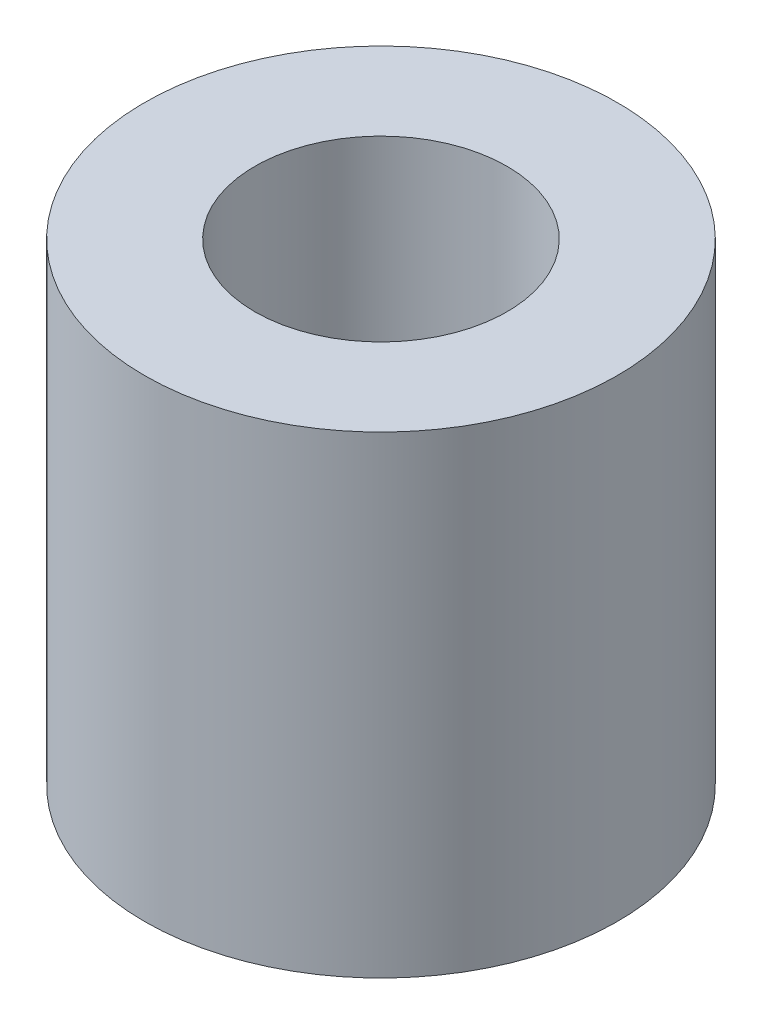
ISO-10303-21;
HEADER;
FILE_DESCRIPTION(('STEP AP214'),'2;1');
FILE_NAME('part.step','',(''),(''),'','','');
FILE_SCHEMA(('AUTOMOTIVE_DESIGN { 1 0 10303 214 1 1 1 1 }'));
ENDSEC;
DATA;
#1=APPLICATION_CONTEXT('core data for automotive mechanical design processes');
#2=APPLICATION_PROTOCOL_DEFINITION('international standard','automotive_design',2000,#1);
#3=PRODUCT_CONTEXT('',#1,'mechanical');
#4=PRODUCT('Part','Part','',(#3));
#5=PRODUCT_RELATED_PRODUCT_CATEGORY('part','',(#4));
#6=PRODUCT_DEFINITION_FORMATION('','',#4);
#7=PRODUCT_DEFINITION_CONTEXT('part definition',#1,'design');
#8=PRODUCT_DEFINITION('design','',#6,#7);
#9=PRODUCT_DEFINITION_SHAPE('','',#8);
#10=(LENGTH_UNIT() NAMED_UNIT(*) SI_UNIT(.MILLI.,.METRE.));
#11=(NAMED_UNIT(*) PLANE_ANGLE_UNIT() SI_UNIT($,.RADIAN.));
#12=(NAMED_UNIT(*) SI_UNIT($,.STERADIAN.) SOLID_ANGLE_UNIT());
#13=UNCERTAINTY_MEASURE_WITH_UNIT(LENGTH_MEASURE(1.E-05),#10,'distance_accuracy_value','');
#14=(GEOMETRIC_REPRESENTATION_CONTEXT(3) GLOBAL_UNCERTAINTY_ASSIGNED_CONTEXT((#13)) GLOBAL_UNIT_ASSIGNED_CONTEXT((#10,
#11,#12)) REPRESENTATION_CONTEXT('',''));
#15=CARTESIAN_POINT('',(0.,0.,0.));
#16=DIRECTION('',(0.,0.,1.));
#17=DIRECTION('',(1.,0.,0.));
#18=AXIS2_PLACEMENT_3D('',#15,#16,#17);
#19=CARTESIAN_POINT('',(0.,6.,0.));
#20=DIRECTION('',(0.,1.,0.));
#21=DIRECTION('',(0.,0.,1.));
#22=AXIS2_PLACEMENT_3D('',#19,#20,#21);
#23=PLANE('',#22);
#24=CARTESIAN_POINT('',(0.,6.,0.));
#25=DIRECTION('',(0.,1.,0.));
#26=DIRECTION('',(0.,0.,1.));
#27=AXIS2_PLACEMENT_3D('',#24,#25,#26);
#28=CIRCLE('',#27,3.);
#29=CARTESIAN_POINT('',(0.,6.,3.));
#30=VERTEX_POINT('',#29);
#31=EDGE_CURVE('E10',#30,#30,#28,.T.);
#32=ORIENTED_EDGE('',*,*,#31,.T.);
#33=EDGE_LOOP('',(#32));
#34=FACE_BOUND('',#33,.T.);
#35=CARTESIAN_POINT('',(0.,6.,0.));
#36=DIRECTION('',(0.,1.,0.));
#37=DIRECTION('',(0.,0.,1.));
#38=AXIS2_PLACEMENT_3D('',#35,#36,#37);
#39=CIRCLE('',#38,1.6);
#40=CARTESIAN_POINT('',(0.,6.,1.6));
#41=VERTEX_POINT('',#40);
#42=EDGE_CURVE('E44',#41,#41,#39,.T.);
#43=ORIENTED_EDGE('',*,*,#42,.F.);
#44=EDGE_LOOP('',(#43));
#45=FACE_BOUND('',#44,.T.);
#46=ADVANCED_FACE('F33',(#34,#45),#23,.T.);
#47=CARTESIAN_POINT('',(0.,0.,0.));
#48=DIRECTION('',(0.,1.,0.));
#49=DIRECTION('',(0.,0.,1.));
#50=AXIS2_PLACEMENT_3D('',#47,#48,#49);
#51=PLANE('',#50);
#52=CARTESIAN_POINT('',(0.,0.,0.));
#53=DIRECTION('',(0.,1.,0.));
#54=DIRECTION('',(0.,0.,1.));
#55=AXIS2_PLACEMENT_3D('',#52,#53,#54);
#56=CIRCLE('',#55,3.);
#57=CARTESIAN_POINT('',(0.,0.,3.));
#58=VERTEX_POINT('',#57);
#59=EDGE_CURVE('E37',#58,#58,#56,.T.);
#60=ORIENTED_EDGE('',*,*,#59,.F.);
#61=EDGE_LOOP('',(#60));
#62=FACE_BOUND('',#61,.T.);
#63=CARTESIAN_POINT('',(0.,0.,0.));
#64=DIRECTION('',(0.,1.,0.));
#65=DIRECTION('',(0.,0.,1.));
#66=AXIS2_PLACEMENT_3D('',#63,#64,#65);
#67=CIRCLE('',#66,1.6);
#68=CARTESIAN_POINT('',(0.,0.,1.6));
#69=VERTEX_POINT('',#68);
#70=EDGE_CURVE('E46',#69,#69,#67,.T.);
#71=ORIENTED_EDGE('',*,*,#70,.T.);
#72=EDGE_LOOP('',(#71));
#73=FACE_BOUND('',#72,.T.);
#74=ADVANCED_FACE('F56',(#62,#73),#51,.F.);
#75=CARTESIAN_POINT('',(0.,6.,0.));
#76=DIRECTION('',(0.,-1.,0.));
#77=DIRECTION('',(0.,0.,-1.));
#78=AXIS2_PLACEMENT_3D('',#75,#76,#77);
#79=CYLINDRICAL_SURFACE('',#78,3.);
#80=ORIENTED_EDGE('',*,*,#31,.F.);
#81=EDGE_LOOP('',(#80));
#82=FACE_BOUND('',#81,.T.);
#83=ORIENTED_EDGE('',*,*,#59,.T.);
#84=EDGE_LOOP('',(#83));
#85=FACE_BOUND('',#84,.T.);
#86=ADVANCED_FACE('F35',(#82,#85),#79,.T.);
#87=CARTESIAN_POINT('',(0.,6.,0.));
#88=DIRECTION('',(0.,-1.,0.));
#89=DIRECTION('',(0.,0.,-1.));
#90=AXIS2_PLACEMENT_3D('',#87,#88,#89);
#91=CYLINDRICAL_SURFACE('',#90,1.6);
#92=ORIENTED_EDGE('',*,*,#42,.T.);
#93=EDGE_LOOP('',(#92));
#94=FACE_BOUND('',#93,.T.);
#95=ORIENTED_EDGE('',*,*,#70,.F.);
#96=EDGE_LOOP('',(#95));
#97=FACE_BOUND('',#96,.T.);
#98=ADVANCED_FACE('F52',(#94,#97),#91,.F.);
#99=CLOSED_SHELL('',(#46,#74,#86,#98));
#100=MANIFOLD_SOLID_BREP('B2',#99);
#101=ADVANCED_BREP_SHAPE_REPRESENTATION('',(#18,#100),#14);
#102=SHAPE_DEFINITION_REPRESENTATION(#9,#101);
ENDSEC;
END-ISO-10303-21;
